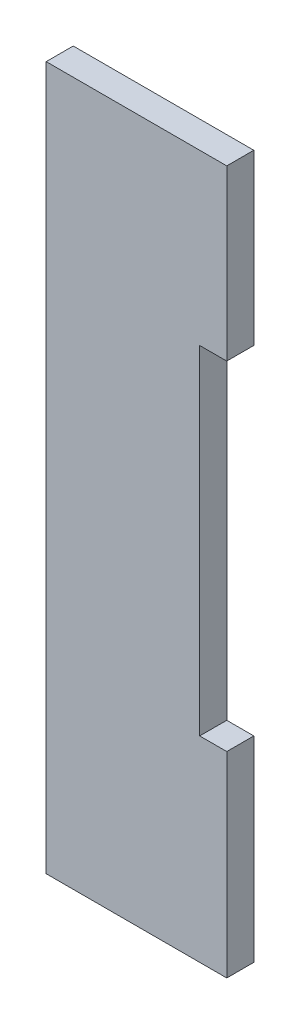
ISO-10303-21;
HEADER;
FILE_DESCRIPTION(('STEP AP214'),'2;1');
FILE_NAME('part.step','',(''),(''),'','','');
FILE_SCHEMA(('AUTOMOTIVE_DESIGN { 1 0 10303 214 1 1 1 1 }'));
ENDSEC;
DATA;
#1=APPLICATION_CONTEXT('core data for automotive mechanical design processes');
#2=APPLICATION_PROTOCOL_DEFINITION('international standard','automotive_design',2000,#1);
#3=PRODUCT_CONTEXT('',#1,'mechanical');
#4=PRODUCT('Part','Part','',(#3));
#5=PRODUCT_RELATED_PRODUCT_CATEGORY('part','',(#4));
#6=PRODUCT_DEFINITION_FORMATION('','',#4);
#7=PRODUCT_DEFINITION_CONTEXT('part definition',#1,'design');
#8=PRODUCT_DEFINITION('design','',#6,#7);
#9=PRODUCT_DEFINITION_SHAPE('','',#8);
#10=(LENGTH_UNIT() NAMED_UNIT(*) SI_UNIT(.MILLI.,.METRE.));
#11=(NAMED_UNIT(*) PLANE_ANGLE_UNIT() SI_UNIT($,.RADIAN.));
#12=(NAMED_UNIT(*) SI_UNIT($,.STERADIAN.) SOLID_ANGLE_UNIT());
#13=UNCERTAINTY_MEASURE_WITH_UNIT(LENGTH_MEASURE(1.E-05),#10,'distance_accuracy_value','');
#14=(GEOMETRIC_REPRESENTATION_CONTEXT(3) GLOBAL_UNCERTAINTY_ASSIGNED_CONTEXT((#13)) GLOBAL_UNIT_ASSIGNED_CONTEXT((#10,
#11,#12)) REPRESENTATION_CONTEXT('',''));
#15=CARTESIAN_POINT('',(0.,0.,0.));
#16=DIRECTION('',(0.,0.,1.));
#17=DIRECTION('',(1.,0.,0.));
#18=AXIS2_PLACEMENT_3D('',#15,#16,#17);
#19=CARTESIAN_POINT('',(7.,-50.5828180431243,4.));
#20=DIRECTION('',(-1.,0.,0.));
#21=DIRECTION('',(0.,-1.,0.));
#22=AXIS2_PLACEMENT_3D('',#19,#20,#21);
#23=PLANE('',#22);
#24=DIRECTION('',(0.,1.,0.));
#25=VECTOR('',#24,1.);
#26=CARTESIAN_POINT('',(7.,-50.5828180431243,0.));
#27=LINE('',#26,#25);
#28=CARTESIAN_POINT('',(7.,-54.5828180431243,0.));
#29=VERTEX_POINT('',#28);
#30=CARTESIAN_POINT('',(7.,-25.5828180431243,0.));
#31=VERTEX_POINT('',#30);
#32=EDGE_CURVE('E86',#29,#31,#27,.T.);
#33=ORIENTED_EDGE('',*,*,#32,.T.);
#34=DIRECTION('',(0.,0.,-1.));
#35=VECTOR('',#34,1.);
#36=CARTESIAN_POINT('',(7.,-25.5828180431243,4.));
#37=LINE('',#36,#35);
#38=CARTESIAN_POINT('',(7.,-25.5828180431243,4.));
#39=VERTEX_POINT('',#38);
#40=EDGE_CURVE('E11',#39,#31,#37,.T.);
#41=ORIENTED_EDGE('',*,*,#40,.F.);
#42=DIRECTION('',(0.,1.,0.));
#43=VECTOR('',#42,1.);
#44=CARTESIAN_POINT('',(7.,-50.5828180431243,4.));
#45=LINE('',#44,#43);
#46=CARTESIAN_POINT('',(7.,-54.5828180431243,4.));
#47=VERTEX_POINT('',#46);
#48=EDGE_CURVE('E92',#47,#39,#45,.T.);
#49=ORIENTED_EDGE('',*,*,#48,.F.);
#50=DIRECTION('',(0.,0.,-1.));
#51=VECTOR('',#50,1.);
#52=CARTESIAN_POINT('',(7.,-54.5828180431243,4.));
#53=LINE('',#52,#51);
#54=EDGE_CURVE('E127',#47,#29,#53,.T.);
#55=ORIENTED_EDGE('',*,*,#54,.T.);
#56=EDGE_LOOP('',(#33,#41,#49,#55));
#57=FACE_BOUND('',#56,.T.);
#58=ADVANCED_FACE('F35',(#57),#23,.F.);
#59=CARTESIAN_POINT('',(3.,-25.5828180431243,4.));
#60=DIRECTION('',(0.,-1.,0.));
#61=DIRECTION('',(0.,0.,-1.));
#62=AXIS2_PLACEMENT_3D('',#59,#60,#61);
#63=PLANE('',#62);
#64=DIRECTION('',(-1.,0.,0.));
#65=VECTOR('',#64,1.);
#66=CARTESIAN_POINT('',(3.,-25.5828180431243,0.));
#67=LINE('',#66,#65);
#68=CARTESIAN_POINT('',(3.,-25.5828180431243,0.));
#69=VERTEX_POINT('',#68);
#70=EDGE_CURVE('E132',#31,#69,#67,.T.);
#71=ORIENTED_EDGE('',*,*,#70,.T.);
#72=DIRECTION('',(0.,0.,-1.));
#73=VECTOR('',#72,1.);
#74=CARTESIAN_POINT('',(3.,-25.5828180431243,4.));
#75=LINE('',#74,#73);
#76=CARTESIAN_POINT('',(3.,-25.5828180431243,4.));
#77=VERTEX_POINT('',#76);
#78=EDGE_CURVE('E43',#77,#69,#75,.T.);
#79=ORIENTED_EDGE('',*,*,#78,.F.);
#80=DIRECTION('',(-1.,0.,0.));
#81=VECTOR('',#80,1.);
#82=CARTESIAN_POINT('',(3.,-25.5828180431243,4.));
#83=LINE('',#82,#81);
#84=EDGE_CURVE('E176',#39,#77,#83,.T.);
#85=ORIENTED_EDGE('',*,*,#84,.F.);
#86=ORIENTED_EDGE('',*,*,#40,.T.);
#87=EDGE_LOOP('',(#71,#79,#85,#86));
#88=FACE_BOUND('',#87,.T.);
#89=ADVANCED_FACE('F178',(#88),#63,.F.);
#90=CARTESIAN_POINT('',(3.,-25.5828180431243,4.));
#91=DIRECTION('',(-1.,0.,0.));
#92=DIRECTION('',(0.,-1.,0.));
#93=AXIS2_PLACEMENT_3D('',#90,#91,#92);
#94=PLANE('',#93);
#95=DIRECTION('',(0.,1.,0.));
#96=VECTOR('',#95,1.);
#97=CARTESIAN_POINT('',(3.,-25.5828180431243,0.));
#98=LINE('',#97,#96);
#99=CARTESIAN_POINT('',(2.99999999999999,24.4171819568757,0.));
#100=VERTEX_POINT('',#99);
#101=EDGE_CURVE('E134',#69,#100,#98,.T.);
#102=ORIENTED_EDGE('',*,*,#101,.T.);
#103=DIRECTION('',(0.,0.,-1.));
#104=VECTOR('',#103,1.);
#105=CARTESIAN_POINT('',(2.99999999999999,24.4171819568757,4.));
#106=LINE('',#105,#104);
#107=CARTESIAN_POINT('',(2.99999999999999,24.4171819568757,4.));
#108=VERTEX_POINT('',#107);
#109=EDGE_CURVE('E151',#108,#100,#106,.T.);
#110=ORIENTED_EDGE('',*,*,#109,.F.);
#111=DIRECTION('',(0.,1.,0.));
#112=VECTOR('',#111,1.);
#113=CARTESIAN_POINT('',(3.,-25.5828180431243,4.));
#114=LINE('',#113,#112);
#115=EDGE_CURVE('E160',#77,#108,#114,.T.);
#116=ORIENTED_EDGE('',*,*,#115,.F.);
#117=ORIENTED_EDGE('',*,*,#78,.T.);
#118=EDGE_LOOP('',(#102,#110,#116,#117));
#119=FACE_BOUND('',#118,.T.);
#120=ADVANCED_FACE('F158',(#119),#94,.F.);
#121=CARTESIAN_POINT('',(2.99999999999999,24.4171819568757,4.));
#122=DIRECTION('',(0.,1.,0.));
#123=DIRECTION('',(0.,0.,1.));
#124=AXIS2_PLACEMENT_3D('',#121,#122,#123);
#125=PLANE('',#124);
#126=DIRECTION('',(1.,0.,0.));
#127=VECTOR('',#126,1.);
#128=CARTESIAN_POINT('',(2.99999999999999,24.4171819568757,0.));
#129=LINE('',#128,#127);
#130=CARTESIAN_POINT('',(7.,24.4171819568757,0.));
#131=VERTEX_POINT('',#130);
#132=EDGE_CURVE('E136',#100,#131,#129,.T.);
#133=ORIENTED_EDGE('',*,*,#132,.T.);
#134=DIRECTION('',(0.,0.,-1.));
#135=VECTOR('',#134,1.);
#136=CARTESIAN_POINT('',(7.,24.4171819568757,4.));
#137=LINE('',#136,#135);
#138=CARTESIAN_POINT('',(7.,24.4171819568757,4.));
#139=VERTEX_POINT('',#138);
#140=EDGE_CURVE('E148',#139,#131,#137,.T.);
#141=ORIENTED_EDGE('',*,*,#140,.F.);
#142=DIRECTION('',(1.,0.,0.));
#143=VECTOR('',#142,1.);
#144=CARTESIAN_POINT('',(2.99999999999999,24.4171819568757,4.));
#145=LINE('',#144,#143);
#146=EDGE_CURVE('E172',#108,#139,#145,.T.);
#147=ORIENTED_EDGE('',*,*,#146,.F.);
#148=ORIENTED_EDGE('',*,*,#109,.T.);
#149=EDGE_LOOP('',(#133,#141,#147,#148));
#150=FACE_BOUND('',#149,.T.);
#151=ADVANCED_FACE('F168',(#150),#125,.F.);
#152=CARTESIAN_POINT('',(7.,49.4171819568757,4.));
#153=DIRECTION('',(-1.,0.,0.));
#154=DIRECTION('',(0.,-1.,0.));
#155=AXIS2_PLACEMENT_3D('',#152,#153,#154);
#156=PLANE('',#155);
#157=DIRECTION('',(0.,1.,0.));
#158=VECTOR('',#157,1.);
#159=CARTESIAN_POINT('',(7.,49.4171819568757,0.));
#160=LINE('',#159,#158);
#161=CARTESIAN_POINT('',(7.,49.4171819568757,0.));
#162=VERTEX_POINT('',#161);
#163=EDGE_CURVE('E138',#131,#162,#160,.T.);
#164=ORIENTED_EDGE('',*,*,#163,.T.);
#165=DIRECTION('',(0.,0.,-1.));
#166=VECTOR('',#165,1.);
#167=CARTESIAN_POINT('',(7.,49.4171819568757,4.));
#168=LINE('',#167,#166);
#169=CARTESIAN_POINT('',(7.,49.4171819568757,4.));
#170=VERTEX_POINT('',#169);
#171=EDGE_CURVE('E122',#170,#162,#168,.T.);
#172=ORIENTED_EDGE('',*,*,#171,.F.);
#173=DIRECTION('',(0.,1.,0.));
#174=VECTOR('',#173,1.);
#175=CARTESIAN_POINT('',(7.,49.4171819568757,4.));
#176=LINE('',#175,#174);
#177=EDGE_CURVE('E112',#139,#170,#176,.T.);
#178=ORIENTED_EDGE('',*,*,#177,.F.);
#179=ORIENTED_EDGE('',*,*,#140,.T.);
#180=EDGE_LOOP('',(#164,#172,#178,#179));
#181=FACE_BOUND('',#180,.T.);
#182=ADVANCED_FACE('F171',(#181),#156,.F.);
#183=CARTESIAN_POINT('',(-19.7,49.4171819568757,4.));
#184=DIRECTION('',(0.,-1.,0.));
#185=DIRECTION('',(0.,0.,-1.));
#186=AXIS2_PLACEMENT_3D('',#183,#184,#185);
#187=PLANE('',#186);
#188=DIRECTION('',(-1.,0.,0.));
#189=VECTOR('',#188,1.);
#190=CARTESIAN_POINT('',(-19.7,49.4171819568757,0.));
#191=LINE('',#190,#189);
#192=CARTESIAN_POINT('',(-19.7,49.4171819568757,0.));
#193=VERTEX_POINT('',#192);
#194=EDGE_CURVE('E121',#162,#193,#191,.T.);
#195=ORIENTED_EDGE('',*,*,#194,.T.);
#196=DIRECTION('',(0.,0.,-1.));
#197=VECTOR('',#196,1.);
#198=CARTESIAN_POINT('',(-19.7,49.4171819568757,4.));
#199=LINE('',#198,#197);
#200=CARTESIAN_POINT('',(-19.7,49.4171819568757,4.));
#201=VERTEX_POINT('',#200);
#202=EDGE_CURVE('E118',#201,#193,#199,.T.);
#203=ORIENTED_EDGE('',*,*,#202,.F.);
#204=DIRECTION('',(-1.,0.,0.));
#205=VECTOR('',#204,1.);
#206=CARTESIAN_POINT('',(-19.7,49.4171819568757,4.));
#207=LINE('',#206,#205);
#208=EDGE_CURVE('E106',#170,#201,#207,.T.);
#209=ORIENTED_EDGE('',*,*,#208,.F.);
#210=ORIENTED_EDGE('',*,*,#171,.T.);
#211=EDGE_LOOP('',(#195,#203,#209,#210));
#212=FACE_BOUND('',#211,.T.);
#213=ADVANCED_FACE('F119',(#212),#187,.F.);
#214=CARTESIAN_POINT('',(-19.7,-50.5828180431243,4.));
#215=DIRECTION('',(1.,0.,0.));
#216=DIRECTION('',(0.,1.,0.));
#217=AXIS2_PLACEMENT_3D('',#214,#215,#216);
#218=PLANE('',#217);
#219=DIRECTION('',(0.,-1.,0.));
#220=VECTOR('',#219,1.);
#221=CARTESIAN_POINT('',(-19.7,-50.5828180431243,0.));
#222=LINE('',#221,#220);
#223=CARTESIAN_POINT('',(-19.7,-54.5828180431243,0.));
#224=VERTEX_POINT('',#223);
#225=EDGE_CURVE('E79',#193,#224,#222,.T.);
#226=ORIENTED_EDGE('',*,*,#225,.T.);
#227=DIRECTION('',(0.,0.,-1.));
#228=VECTOR('',#227,1.);
#229=CARTESIAN_POINT('',(-19.7,-54.5828180431243,4.));
#230=LINE('',#229,#228);
#231=CARTESIAN_POINT('',(-19.7,-54.5828180431243,4.));
#232=VERTEX_POINT('',#231);
#233=EDGE_CURVE('E123',#232,#224,#230,.T.);
#234=ORIENTED_EDGE('',*,*,#233,.F.);
#235=DIRECTION('',(0.,-1.,0.));
#236=VECTOR('',#235,1.);
#237=CARTESIAN_POINT('',(-19.7,-0.582818043124309,4.));
#238=LINE('',#237,#236);
#239=EDGE_CURVE('E110',#201,#232,#238,.T.);
#240=ORIENTED_EDGE('',*,*,#239,.F.);
#241=ORIENTED_EDGE('',*,*,#202,.T.);
#242=EDGE_LOOP('',(#226,#234,#240,#241));
#243=FACE_BOUND('',#242,.T.);
#244=ADVANCED_FACE('F125',(#243),#218,.F.);
#245=CARTESIAN_POINT('',(-19.7,-54.5828180431243,4.));
#246=DIRECTION('',(0.,1.,0.));
#247=DIRECTION('',(0.,0.,1.));
#248=AXIS2_PLACEMENT_3D('',#245,#246,#247);
#249=PLANE('',#248);
#250=DIRECTION('',(1.,0.,0.));
#251=VECTOR('',#250,1.);
#252=CARTESIAN_POINT('',(-19.7,-54.5828180431243,0.));
#253=LINE('',#252,#251);
#254=EDGE_CURVE('E142',#224,#29,#253,.T.);
#255=ORIENTED_EDGE('',*,*,#254,.T.);
#256=ORIENTED_EDGE('',*,*,#54,.F.);
#257=DIRECTION('',(1.,0.,0.));
#258=VECTOR('',#257,1.);
#259=CARTESIAN_POINT('',(-19.7,-54.5828180431243,4.));
#260=LINE('',#259,#258);
#261=EDGE_CURVE('E51',#232,#47,#260,.T.);
#262=ORIENTED_EDGE('',*,*,#261,.F.);
#263=ORIENTED_EDGE('',*,*,#233,.T.);
#264=EDGE_LOOP('',(#255,#256,#262,#263));
#265=FACE_BOUND('',#264,.T.);
#266=ADVANCED_FACE('F181',(#265),#249,.F.);
#267=CARTESIAN_POINT('',(0.,0.,4.));
#268=DIRECTION('',(0.,0.,1.));
#269=DIRECTION('',(1.,0.,0.));
#270=AXIS2_PLACEMENT_3D('',#267,#268,#269);
#271=PLANE('',#270);
#272=ORIENTED_EDGE('',*,*,#48,.T.);
#273=ORIENTED_EDGE('',*,*,#84,.T.);
#274=ORIENTED_EDGE('',*,*,#115,.T.);
#275=ORIENTED_EDGE('',*,*,#146,.T.);
#276=ORIENTED_EDGE('',*,*,#177,.T.);
#277=ORIENTED_EDGE('',*,*,#208,.T.);
#278=ORIENTED_EDGE('',*,*,#239,.T.);
#279=ORIENTED_EDGE('',*,*,#261,.T.);
#280=EDGE_LOOP('',(#272,#273,#274,#275,#276,#277,#278,#279));
#281=FACE_BOUND('',#280,.T.);
#282=ADVANCED_FACE('F108',(#281),#271,.T.);
#283=CARTESIAN_POINT('',(0.,0.,0.));
#284=DIRECTION('',(0.,0.,1.));
#285=DIRECTION('',(1.,0.,0.));
#286=AXIS2_PLACEMENT_3D('',#283,#284,#285);
#287=PLANE('',#286);
#288=ORIENTED_EDGE('',*,*,#32,.F.);
#289=ORIENTED_EDGE('',*,*,#254,.F.);
#290=ORIENTED_EDGE('',*,*,#225,.F.);
#291=ORIENTED_EDGE('',*,*,#194,.F.);
#292=ORIENTED_EDGE('',*,*,#163,.F.);
#293=ORIENTED_EDGE('',*,*,#132,.F.);
#294=ORIENTED_EDGE('',*,*,#101,.F.);
#295=ORIENTED_EDGE('',*,*,#70,.F.);
#296=EDGE_LOOP('',(#288,#289,#290,#291,#292,#293,#294,#295));
#297=FACE_BOUND('',#296,.T.);
#298=ADVANCED_FACE('F164',(#297),#287,.F.);
#299=CLOSED_SHELL('',(#58,#89,#120,#151,#182,#213,#244,#266,#282,#298));
#300=MANIFOLD_SOLID_BREP('B2',#299);
#301=ADVANCED_BREP_SHAPE_REPRESENTATION('',(#18,#300),#14);
#302=SHAPE_DEFINITION_REPRESENTATION(#9,#301);
ENDSEC;
END-ISO-10303-21;
